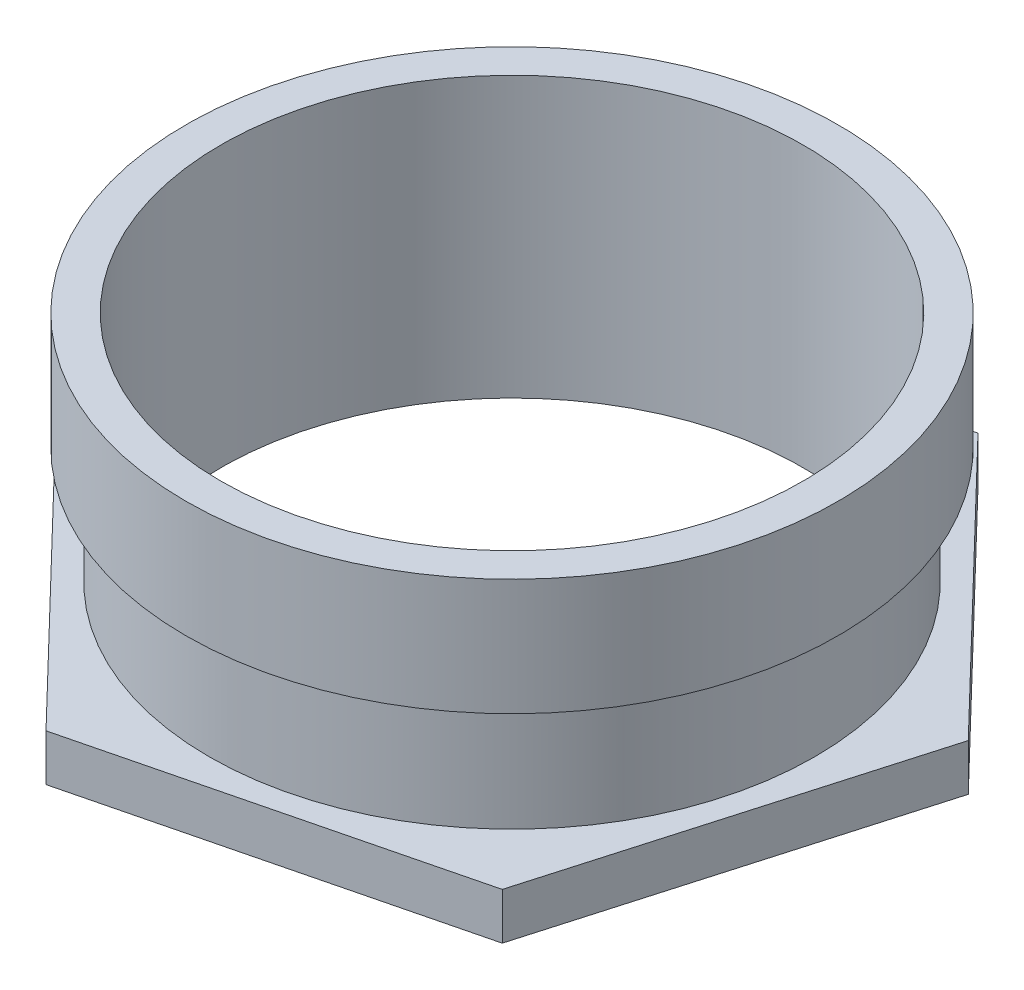
ISO-10303-21;
HEADER;
FILE_DESCRIPTION(('STEP AP214'),'2;1');
FILE_NAME('part.step','',(''),(''),'','','');
FILE_SCHEMA(('AUTOMOTIVE_DESIGN { 1 0 10303 214 1 1 1 1 }'));
ENDSEC;
DATA;
#1=APPLICATION_CONTEXT('core data for automotive mechanical design processes');
#2=APPLICATION_PROTOCOL_DEFINITION('international standard','automotive_design',2000,#1);
#3=PRODUCT_CONTEXT('',#1,'mechanical');
#4=PRODUCT('Part','Part','',(#3));
#5=PRODUCT_RELATED_PRODUCT_CATEGORY('part','',(#4));
#6=PRODUCT_DEFINITION_FORMATION('','',#4);
#7=PRODUCT_DEFINITION_CONTEXT('part definition',#1,'design');
#8=PRODUCT_DEFINITION('design','',#6,#7);
#9=PRODUCT_DEFINITION_SHAPE('','',#8);
#10=(LENGTH_UNIT() NAMED_UNIT(*) SI_UNIT(.MILLI.,.METRE.));
#11=(NAMED_UNIT(*) PLANE_ANGLE_UNIT() SI_UNIT($,.RADIAN.));
#12=(NAMED_UNIT(*) SI_UNIT($,.STERADIAN.) SOLID_ANGLE_UNIT());
#13=UNCERTAINTY_MEASURE_WITH_UNIT(LENGTH_MEASURE(1.E-05),#10,'distance_accuracy_value','');
#14=(GEOMETRIC_REPRESENTATION_CONTEXT(3) GLOBAL_UNCERTAINTY_ASSIGNED_CONTEXT((#13)) GLOBAL_UNIT_ASSIGNED_CONTEXT((#10,
#11,#12)) REPRESENTATION_CONTEXT('',''));
#15=CARTESIAN_POINT('',(0.,0.,0.));
#16=DIRECTION('',(0.,0.,1.));
#17=DIRECTION('',(1.,0.,0.));
#18=AXIS2_PLACEMENT_3D('',#15,#16,#17);
#19=CARTESIAN_POINT('',(0.,2.,0.));
#20=DIRECTION('',(0.,1.,0.));
#21=DIRECTION('',(0.,0.,1.));
#22=AXIS2_PLACEMENT_3D('',#19,#20,#21);
#23=PLANE('',#22);
#24=DIRECTION('',(0.276446024056728,0.,-0.961029445846082));
#25=VECTOR('',#24,1.);
#26=CARTESIAN_POINT('',(11.2199256321674,2.,11.6381528664116));
#27=LINE('',#26,#25);
#28=CARTESIAN_POINT('',(11.2199256321674,2.,11.6381528664116));
#29=VERTEX_POINT('',#28);
#30=CARTESIAN_POINT('',(15.6888988515228,2.,-3.89766419282329));
#31=VERTEX_POINT('',#30);
#32=EDGE_CURVE('E148',#29,#31,#27,.T.);
#33=ORIENTED_EDGE('',*,*,#32,.T.);
#34=DIRECTION('',(-0.694052901859224,0.,-0.719924002531371));
#35=VECTOR('',#34,1.);
#36=CARTESIAN_POINT('',(15.6888988515228,2.,-3.89766419282329));
#37=LINE('',#36,#35);
#38=CARTESIAN_POINT('',(4.46897321935548,2.,-15.5358170592349));
#39=VERTEX_POINT('',#38);
#40=EDGE_CURVE('E96',#31,#39,#37,.T.);
#41=ORIENTED_EDGE('',*,*,#40,.T.);
#42=DIRECTION('',(-0.970498925915952,0.,0.241105443314711));
#43=VECTOR('',#42,1.);
#44=CARTESIAN_POINT('',(4.46897321935548,2.,-15.5358170592349));
#45=LINE('',#44,#43);
#46=CARTESIAN_POINT('',(-11.2199256321674,2.,-11.6381528664116));
#47=VERTEX_POINT('',#46);
#48=EDGE_CURVE('E109',#39,#47,#45,.T.);
#49=ORIENTED_EDGE('',*,*,#48,.T.);
#50=DIRECTION('',(-0.276446024056727,0.,0.961029445846082));
#51=VECTOR('',#50,1.);
#52=CARTESIAN_POINT('',(-11.2199256321674,2.,-11.6381528664116));
#53=LINE('',#52,#51);
#54=CARTESIAN_POINT('',(-15.6888988515228,2.,3.89766419282329));
#55=VERTEX_POINT('',#54);
#56=EDGE_CURVE('E103',#47,#55,#53,.T.);
#57=ORIENTED_EDGE('',*,*,#56,.T.);
#58=DIRECTION('',(0.694052901859225,0.,0.719924002531371));
#59=VECTOR('',#58,1.);
#60=CARTESIAN_POINT('',(-15.6888988515228,2.,3.89766419282329));
#61=LINE('',#60,#59);
#62=CARTESIAN_POINT('',(-4.46897321935548,2.,15.5358170592349));
#63=VERTEX_POINT('',#62);
#64=EDGE_CURVE('E107',#55,#63,#61,.T.);
#65=ORIENTED_EDGE('',*,*,#64,.T.);
#66=DIRECTION('',(0.970498925915952,0.,-0.241105443314711));
#67=VECTOR('',#66,1.);
#68=CARTESIAN_POINT('',(-4.46897321935548,2.,15.5358170592349));
#69=LINE('',#68,#67);
#70=EDGE_CURVE('E59',#63,#29,#69,.T.);
#71=ORIENTED_EDGE('',*,*,#70,.T.);
#72=EDGE_LOOP('',(#33,#41,#49,#57,#65,#71));
#73=FACE_BOUND('',#72,.T.);
#74=CARTESIAN_POINT('',(0.,2.,0.));
#75=DIRECTION('',(0.,1.,0.));
#76=DIRECTION('',(0.,0.,1.));
#77=AXIS2_PLACEMENT_3D('',#74,#75,#76);
#78=CIRCLE('',#77,13.);
#79=CARTESIAN_POINT('',(0.,2.,13.));
#80=VERTEX_POINT('',#79);
#81=EDGE_CURVE('E217',#80,#80,#78,.T.);
#82=ORIENTED_EDGE('',*,*,#81,.F.);
#83=EDGE_LOOP('',(#82));
#84=FACE_BOUND('',#83,.T.);
#85=ADVANCED_FACE('F41',(#73,#84),#23,.T.);
#86=CARTESIAN_POINT('',(0.,0.,0.));
#87=DIRECTION('',(0.,1.,0.));
#88=DIRECTION('',(0.,0.,1.));
#89=AXIS2_PLACEMENT_3D('',#86,#87,#88);
#90=PLANE('',#89);
#91=DIRECTION('',(0.276446024056728,0.,-0.961029445846082));
#92=VECTOR('',#91,1.);
#93=CARTESIAN_POINT('',(11.2199256321674,0.,11.6381528664116));
#94=LINE('',#93,#92);
#95=CARTESIAN_POINT('',(11.2199256321674,0.,11.6381528664116));
#96=VERTEX_POINT('',#95);
#97=CARTESIAN_POINT('',(15.6888988515228,0.,-3.89766419282329));
#98=VERTEX_POINT('',#97);
#99=EDGE_CURVE('E131',#96,#98,#94,.T.);
#100=ORIENTED_EDGE('',*,*,#99,.F.);
#101=DIRECTION('',(0.970498925915952,0.,-0.241105443314711));
#102=VECTOR('',#101,1.);
#103=CARTESIAN_POINT('',(-4.46897321935548,0.,15.5358170592349));
#104=LINE('',#103,#102);
#105=CARTESIAN_POINT('',(-4.46897321935548,0.,15.5358170592349));
#106=VERTEX_POINT('',#105);
#107=EDGE_CURVE('E88',#106,#96,#104,.T.);
#108=ORIENTED_EDGE('',*,*,#107,.F.);
#109=DIRECTION('',(0.694052901859225,0.,0.719924002531371));
#110=VECTOR('',#109,1.);
#111=CARTESIAN_POINT('',(-15.6888988515228,0.,3.89766419282329));
#112=LINE('',#111,#110);
#113=CARTESIAN_POINT('',(-15.6888988515228,0.,3.89766419282329));
#114=VERTEX_POINT('',#113);
#115=EDGE_CURVE('E82',#114,#106,#112,.T.);
#116=ORIENTED_EDGE('',*,*,#115,.F.);
#117=DIRECTION('',(-0.276446024056727,0.,0.961029445846082));
#118=VECTOR('',#117,1.);
#119=CARTESIAN_POINT('',(-11.2199256321674,0.,-11.6381528664116));
#120=LINE('',#119,#118);
#121=CARTESIAN_POINT('',(-11.2199256321674,0.,-11.6381528664116));
#122=VERTEX_POINT('',#121);
#123=EDGE_CURVE('E118',#122,#114,#120,.T.);
#124=ORIENTED_EDGE('',*,*,#123,.F.);
#125=DIRECTION('',(-0.970498925915952,0.,0.241105443314711));
#126=VECTOR('',#125,1.);
#127=CARTESIAN_POINT('',(4.46897321935548,0.,-15.5358170592349));
#128=LINE('',#127,#126);
#129=CARTESIAN_POINT('',(4.46897321935548,0.,-15.5358170592349));
#130=VERTEX_POINT('',#129);
#131=EDGE_CURVE('E139',#130,#122,#128,.T.);
#132=ORIENTED_EDGE('',*,*,#131,.F.);
#133=DIRECTION('',(-0.694052901859224,0.,-0.719924002531371));
#134=VECTOR('',#133,1.);
#135=CARTESIAN_POINT('',(15.6888988515228,0.,-3.89766419282329));
#136=LINE('',#135,#134);
#137=EDGE_CURVE('E135',#98,#130,#136,.T.);
#138=ORIENTED_EDGE('',*,*,#137,.F.);
#139=EDGE_LOOP('',(#100,#108,#116,#124,#132,#138));
#140=FACE_BOUND('',#139,.T.);
#141=CARTESIAN_POINT('',(0.,0.,0.));
#142=DIRECTION('',(0.,1.,0.));
#143=DIRECTION('',(0.,0.,1.));
#144=AXIS2_PLACEMENT_3D('',#141,#142,#143);
#145=CIRCLE('',#144,12.5);
#146=CARTESIAN_POINT('',(0.,0.,12.5));
#147=VERTEX_POINT('',#146);
#148=EDGE_CURVE('E136',#147,#147,#145,.T.);
#149=ORIENTED_EDGE('',*,*,#148,.T.);
#150=EDGE_LOOP('',(#149));
#151=FACE_BOUND('',#150,.T.);
#152=ADVANCED_FACE('F161',(#140,#151),#90,.F.);
#153=CARTESIAN_POINT('',(11.2199256321674,2.,11.6381528664116));
#154=DIRECTION('',(-0.961029445846082,0.,-0.276446024056728));
#155=DIRECTION('',(-0.276446024056728,0.,0.961029445846082));
#156=AXIS2_PLACEMENT_3D('',#153,#154,#155);
#157=PLANE('',#156);
#158=ORIENTED_EDGE('',*,*,#99,.T.);
#159=DIRECTION('',(0.,-1.,0.));
#160=VECTOR('',#159,1.);
#161=CARTESIAN_POINT('',(15.6888988515228,2.,-3.89766419282329));
#162=LINE('',#161,#160);
#163=EDGE_CURVE('E11',#31,#98,#162,.T.);
#164=ORIENTED_EDGE('',*,*,#163,.F.);
#165=ORIENTED_EDGE('',*,*,#32,.F.);
#166=DIRECTION('',(0.,-1.,0.));
#167=VECTOR('',#166,1.);
#168=CARTESIAN_POINT('',(11.2199256321674,2.,11.6381528664116));
#169=LINE('',#168,#167);
#170=EDGE_CURVE('E127',#29,#96,#169,.T.);
#171=ORIENTED_EDGE('',*,*,#170,.T.);
#172=EDGE_LOOP('',(#158,#164,#165,#171));
#173=FACE_BOUND('',#172,.T.);
#174=ADVANCED_FACE('F43',(#173),#157,.F.);
#175=CARTESIAN_POINT('',(15.6888988515228,2.,-3.89766419282329));
#176=DIRECTION('',(-0.719924002531371,0.,0.694052901859224));
#177=DIRECTION('',(0.694052901859224,0.,0.719924002531371));
#178=AXIS2_PLACEMENT_3D('',#175,#176,#177);
#179=PLANE('',#178);
#180=ORIENTED_EDGE('',*,*,#137,.T.);
#181=DIRECTION('',(0.,-1.,0.));
#182=VECTOR('',#181,1.);
#183=CARTESIAN_POINT('',(4.46897321935548,2.,-15.5358170592349));
#184=LINE('',#183,#182);
#185=EDGE_CURVE('E51',#39,#130,#184,.T.);
#186=ORIENTED_EDGE('',*,*,#185,.F.);
#187=ORIENTED_EDGE('',*,*,#40,.F.);
#188=ORIENTED_EDGE('',*,*,#163,.T.);
#189=EDGE_LOOP('',(#180,#186,#187,#188));
#190=FACE_BOUND('',#189,.T.);
#191=ADVANCED_FACE('F298',(#190),#179,.F.);
#192=CARTESIAN_POINT('',(4.46897321935548,2.,-15.5358170592349));
#193=DIRECTION('',(0.241105443314711,0.,0.970498925915952));
#194=DIRECTION('',(0.970498925915952,0.,-0.241105443314711));
#195=AXIS2_PLACEMENT_3D('',#192,#193,#194);
#196=PLANE('',#195);
#197=ORIENTED_EDGE('',*,*,#131,.T.);
#198=DIRECTION('',(0.,-1.,0.));
#199=VECTOR('',#198,1.);
#200=CARTESIAN_POINT('',(-11.2199256321674,2.,-11.6381528664116));
#201=LINE('',#200,#199);
#202=EDGE_CURVE('E120',#47,#122,#201,.T.);
#203=ORIENTED_EDGE('',*,*,#202,.F.);
#204=ORIENTED_EDGE('',*,*,#48,.F.);
#205=ORIENTED_EDGE('',*,*,#185,.T.);
#206=EDGE_LOOP('',(#197,#203,#204,#205));
#207=FACE_BOUND('',#206,.T.);
#208=ADVANCED_FACE('F158',(#207),#196,.F.);
#209=CARTESIAN_POINT('',(-11.2199256321674,2.,-11.6381528664116));
#210=DIRECTION('',(0.961029445846082,0.,0.276446024056727));
#211=DIRECTION('',(0.276446024056727,0.,-0.961029445846082));
#212=AXIS2_PLACEMENT_3D('',#209,#210,#211);
#213=PLANE('',#212);
#214=ORIENTED_EDGE('',*,*,#123,.T.);
#215=DIRECTION('',(0.,-1.,0.));
#216=VECTOR('',#215,1.);
#217=CARTESIAN_POINT('',(-15.6888988515228,2.,3.89766419282329));
#218=LINE('',#217,#216);
#219=EDGE_CURVE('E115',#55,#114,#218,.T.);
#220=ORIENTED_EDGE('',*,*,#219,.F.);
#221=ORIENTED_EDGE('',*,*,#56,.F.);
#222=ORIENTED_EDGE('',*,*,#202,.T.);
#223=EDGE_LOOP('',(#214,#220,#221,#222));
#224=FACE_BOUND('',#223,.T.);
#225=ADVANCED_FACE('F116',(#224),#213,.F.);
#226=CARTESIAN_POINT('',(-15.6888988515228,2.,3.89766419282329));
#227=DIRECTION('',(0.719924002531371,0.,-0.694052901859225));
#228=DIRECTION('',(-0.694052901859225,0.,-0.719924002531371));
#229=AXIS2_PLACEMENT_3D('',#226,#227,#228);
#230=PLANE('',#229);
#231=ORIENTED_EDGE('',*,*,#115,.T.);
#232=DIRECTION('',(0.,-1.,0.));
#233=VECTOR('',#232,1.);
#234=CARTESIAN_POINT('',(-4.46897321935548,2.,15.5358170592349));
#235=LINE('',#234,#233);
#236=EDGE_CURVE('E121',#63,#106,#235,.T.);
#237=ORIENTED_EDGE('',*,*,#236,.F.);
#238=ORIENTED_EDGE('',*,*,#64,.F.);
#239=ORIENTED_EDGE('',*,*,#219,.T.);
#240=EDGE_LOOP('',(#231,#237,#238,#239));
#241=FACE_BOUND('',#240,.T.);
#242=ADVANCED_FACE('F123',(#241),#230,.F.);
#243=CARTESIAN_POINT('',(-4.46897321935548,2.,15.5358170592349));
#244=DIRECTION('',(-0.241105443314711,0.,-0.970498925915952));
#245=DIRECTION('',(-0.970498925915952,0.,0.241105443314711));
#246=AXIS2_PLACEMENT_3D('',#243,#244,#245);
#247=PLANE('',#246);
#248=ORIENTED_EDGE('',*,*,#107,.T.);
#249=ORIENTED_EDGE('',*,*,#170,.F.);
#250=ORIENTED_EDGE('',*,*,#70,.F.);
#251=ORIENTED_EDGE('',*,*,#236,.T.);
#252=EDGE_LOOP('',(#248,#249,#250,#251));
#253=FACE_BOUND('',#252,.T.);
#254=ADVANCED_FACE('F166',(#253),#247,.F.);
#255=CARTESIAN_POINT('',(0.,2.,0.));
#256=DIRECTION('',(0.,-1.,0.));
#257=DIRECTION('',(0.,0.,-1.));
#258=AXIS2_PLACEMENT_3D('',#255,#256,#257);
#259=CYLINDRICAL_SURFACE('',#258,12.5);
#260=ORIENTED_EDGE('',*,*,#148,.F.);
#261=EDGE_LOOP('',(#260));
#262=FACE_BOUND('',#261,.T.);
#263=CARTESIAN_POINT('',(0.,12.,0.));
#264=DIRECTION('',(0.,1.,0.));
#265=DIRECTION('',(0.,0.,1.));
#266=AXIS2_PLACEMENT_3D('',#263,#264,#265);
#267=CIRCLE('',#266,12.5);
#268=CARTESIAN_POINT('',(0.,12.,12.5));
#269=VERTEX_POINT('',#268);
#270=EDGE_CURVE('E207',#269,#269,#267,.T.);
#271=ORIENTED_EDGE('',*,*,#270,.T.);
#272=EDGE_LOOP('',(#271));
#273=FACE_BOUND('',#272,.T.);
#274=ADVANCED_FACE('F168',(#262,#273),#259,.F.);
#275=CARTESIAN_POINT('',(0.,7.,0.));
#276=DIRECTION('',(0.,-1.,0.));
#277=DIRECTION('',(0.,0.,-1.));
#278=AXIS2_PLACEMENT_3D('',#275,#276,#277);
#279=CYLINDRICAL_SURFACE('',#278,13.);
#280=CARTESIAN_POINT('',(0.,7.,0.));
#281=DIRECTION('',(0.,1.,0.));
#282=DIRECTION('',(0.,0.,1.));
#283=AXIS2_PLACEMENT_3D('',#280,#281,#282);
#284=CIRCLE('',#283,13.);
#285=CARTESIAN_POINT('',(0.,7.,13.));
#286=VERTEX_POINT('',#285);
#287=EDGE_CURVE('E219',#286,#286,#284,.T.);
#288=ORIENTED_EDGE('',*,*,#287,.F.);
#289=EDGE_LOOP('',(#288));
#290=FACE_BOUND('',#289,.T.);
#291=ORIENTED_EDGE('',*,*,#81,.T.);
#292=EDGE_LOOP('',(#291));
#293=FACE_BOUND('',#292,.T.);
#294=ADVANCED_FACE('F174',(#290,#293),#279,.T.);
#295=CARTESIAN_POINT('',(0.,12.,0.));
#296=DIRECTION('',(0.,1.,0.));
#297=DIRECTION('',(0.,0.,1.));
#298=AXIS2_PLACEMENT_3D('',#295,#296,#297);
#299=PLANE('',#298);
#300=CARTESIAN_POINT('',(0.,12.,0.));
#301=DIRECTION('',(0.,1.,0.));
#302=DIRECTION('',(0.,0.,1.));
#303=AXIS2_PLACEMENT_3D('',#300,#301,#302);
#304=CIRCLE('',#303,14.);
#305=CARTESIAN_POINT('',(0.,12.,14.));
#306=VERTEX_POINT('',#305);
#307=EDGE_CURVE('E204',#306,#306,#304,.T.);
#308=ORIENTED_EDGE('',*,*,#307,.T.);
#309=EDGE_LOOP('',(#308));
#310=FACE_BOUND('',#309,.T.);
#311=ORIENTED_EDGE('',*,*,#270,.F.);
#312=EDGE_LOOP('',(#311));
#313=FACE_BOUND('',#312,.T.);
#314=ADVANCED_FACE('F187',(#310,#313),#299,.T.);
#315=CARTESIAN_POINT('',(0.,7.,0.));
#316=DIRECTION('',(0.,1.,0.));
#317=DIRECTION('',(0.,0.,1.));
#318=AXIS2_PLACEMENT_3D('',#315,#316,#317);
#319=PLANE('',#318);
#320=ORIENTED_EDGE('',*,*,#287,.T.);
#321=EDGE_LOOP('',(#320));
#322=FACE_BOUND('',#321,.T.);
#323=CARTESIAN_POINT('',(0.,7.,0.));
#324=DIRECTION('',(0.,1.,0.));
#325=DIRECTION('',(0.,0.,1.));
#326=AXIS2_PLACEMENT_3D('',#323,#324,#325);
#327=CIRCLE('',#326,14.);
#328=CARTESIAN_POINT('',(0.,7.,14.));
#329=VERTEX_POINT('',#328);
#330=EDGE_CURVE('E210',#329,#329,#327,.T.);
#331=ORIENTED_EDGE('',*,*,#330,.F.);
#332=EDGE_LOOP('',(#331));
#333=FACE_BOUND('',#332,.T.);
#334=ADVANCED_FACE('F192',(#322,#333),#319,.F.);
#335=CARTESIAN_POINT('',(0.,12.,0.));
#336=DIRECTION('',(0.,-1.,0.));
#337=DIRECTION('',(0.,0.,-1.));
#338=AXIS2_PLACEMENT_3D('',#335,#336,#337);
#339=CYLINDRICAL_SURFACE('',#338,14.);
#340=ORIENTED_EDGE('',*,*,#307,.F.);
#341=EDGE_LOOP('',(#340));
#342=FACE_BOUND('',#341,.T.);
#343=ORIENTED_EDGE('',*,*,#330,.T.);
#344=EDGE_LOOP('',(#343));
#345=FACE_BOUND('',#344,.T.);
#346=ADVANCED_FACE('F189',(#342,#345),#339,.T.);
#347=CLOSED_SHELL('',(#85,#152,#174,#191,#208,#225,#242,#254,#274,#294,#314,#334,#346));
#348=MANIFOLD_SOLID_BREP('B2',#347);
#349=ADVANCED_BREP_SHAPE_REPRESENTATION('',(#18,#348),#14);
#350=SHAPE_DEFINITION_REPRESENTATION(#9,#349);
ENDSEC;
END-ISO-10303-21;
